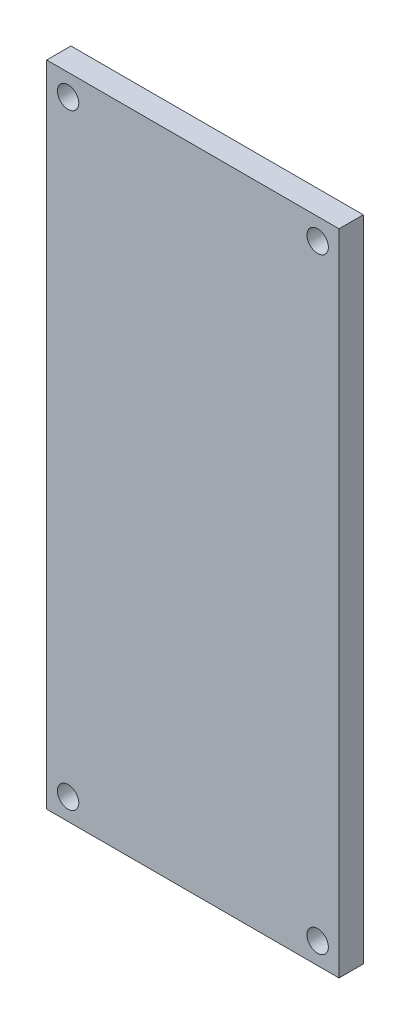
ISO-10303-21;
HEADER;
FILE_DESCRIPTION(('STEP AP214'),'2;1');
FILE_NAME('part.step','',(''),(''),'','','');
FILE_SCHEMA(('AUTOMOTIVE_DESIGN { 1 0 10303 214 1 1 1 1 }'));
ENDSEC;
DATA;
#1=APPLICATION_CONTEXT('core data for automotive mechanical design processes');
#2=APPLICATION_PROTOCOL_DEFINITION('international standard','automotive_design',2000,#1);
#3=PRODUCT_CONTEXT('',#1,'mechanical');
#4=PRODUCT('Part','Part','',(#3));
#5=PRODUCT_RELATED_PRODUCT_CATEGORY('part','',(#4));
#6=PRODUCT_DEFINITION_FORMATION('','',#4);
#7=PRODUCT_DEFINITION_CONTEXT('part definition',#1,'design');
#8=PRODUCT_DEFINITION('design','',#6,#7);
#9=PRODUCT_DEFINITION_SHAPE('','',#8);
#10=(LENGTH_UNIT() NAMED_UNIT(*) SI_UNIT(.MILLI.,.METRE.));
#11=(NAMED_UNIT(*) PLANE_ANGLE_UNIT() SI_UNIT($,.RADIAN.));
#12=(NAMED_UNIT(*) SI_UNIT($,.STERADIAN.) SOLID_ANGLE_UNIT());
#13=UNCERTAINTY_MEASURE_WITH_UNIT(LENGTH_MEASURE(1.E-05),#10,'distance_accuracy_value','');
#14=(GEOMETRIC_REPRESENTATION_CONTEXT(3) GLOBAL_UNCERTAINTY_ASSIGNED_CONTEXT((#13)) GLOBAL_UNIT_ASSIGNED_CONTEXT((#10,
#11,#12)) REPRESENTATION_CONTEXT('',''));
#15=CARTESIAN_POINT('',(0.,0.,0.));
#16=DIRECTION('',(0.,0.,1.));
#17=DIRECTION('',(1.,0.,0.));
#18=AXIS2_PLACEMENT_3D('',#15,#16,#17);
#19=CARTESIAN_POINT('',(-10.25,22.75,1.7));
#20=DIRECTION('',(1.,0.,0.));
#21=DIRECTION('',(0.,0.,-1.));
#22=AXIS2_PLACEMENT_3D('',#19,#20,#21);
#23=PLANE('',#22);
#24=DIRECTION('',(0.,-1.,0.));
#25=VECTOR('',#24,1.);
#26=CARTESIAN_POINT('',(-10.25,22.75,0.));
#27=LINE('',#26,#25);
#28=CARTESIAN_POINT('',(-10.25,22.75,0.));
#29=VERTEX_POINT('',#28);
#30=CARTESIAN_POINT('',(-10.25,-22.75,0.));
#31=VERTEX_POINT('',#30);
#32=EDGE_CURVE('E98',#29,#31,#27,.T.);
#33=ORIENTED_EDGE('',*,*,#32,.T.);
#34=DIRECTION('',(0.,0.,-1.));
#35=VECTOR('',#34,1.);
#36=CARTESIAN_POINT('',(-10.25,-22.75,1.7));
#37=LINE('',#36,#35);
#38=CARTESIAN_POINT('',(-10.25,-22.75,1.7));
#39=VERTEX_POINT('',#38);
#40=EDGE_CURVE('E11',#39,#31,#37,.T.);
#41=ORIENTED_EDGE('',*,*,#40,.F.);
#42=DIRECTION('',(0.,-1.,0.));
#43=VECTOR('',#42,1.);
#44=CARTESIAN_POINT('',(-10.25,22.75,1.7));
#45=LINE('',#44,#43);
#46=CARTESIAN_POINT('',(-10.25,22.75,1.7));
#47=VERTEX_POINT('',#46);
#48=EDGE_CURVE('E86',#47,#39,#45,.T.);
#49=ORIENTED_EDGE('',*,*,#48,.F.);
#50=DIRECTION('',(0.,0.,-1.));
#51=VECTOR('',#50,1.);
#52=CARTESIAN_POINT('',(-10.25,22.75,1.7));
#53=LINE('',#52,#51);
#54=EDGE_CURVE('E94',#47,#29,#53,.T.);
#55=ORIENTED_EDGE('',*,*,#54,.T.);
#56=EDGE_LOOP('',(#33,#41,#49,#55));
#57=FACE_BOUND('',#56,.T.);
#58=ADVANCED_FACE('F35',(#57),#23,.F.);
#59=CARTESIAN_POINT('',(-10.25,-22.75,1.7));
#60=DIRECTION('',(0.,1.,0.));
#61=DIRECTION('',(0.,0.,1.));
#62=AXIS2_PLACEMENT_3D('',#59,#60,#61);
#63=PLANE('',#62);
#64=DIRECTION('',(1.,0.,0.));
#65=VECTOR('',#64,1.);
#66=CARTESIAN_POINT('',(-10.25,-22.75,0.));
#67=LINE('',#66,#65);
#68=CARTESIAN_POINT('',(10.25,-22.75,0.));
#69=VERTEX_POINT('',#68);
#70=EDGE_CURVE('E90',#31,#69,#67,.T.);
#71=ORIENTED_EDGE('',*,*,#70,.T.);
#72=DIRECTION('',(0.,0.,-1.));
#73=VECTOR('',#72,1.);
#74=CARTESIAN_POINT('',(10.25,-22.75,1.7));
#75=LINE('',#74,#73);
#76=CARTESIAN_POINT('',(10.25,-22.75,1.7));
#77=VERTEX_POINT('',#76);
#78=EDGE_CURVE('E43',#77,#69,#75,.T.);
#79=ORIENTED_EDGE('',*,*,#78,.F.);
#80=DIRECTION('',(1.,0.,0.));
#81=VECTOR('',#80,1.);
#82=CARTESIAN_POINT('',(-10.25,-22.75,1.7));
#83=LINE('',#82,#81);
#84=EDGE_CURVE('E81',#39,#77,#83,.T.);
#85=ORIENTED_EDGE('',*,*,#84,.F.);
#86=ORIENTED_EDGE('',*,*,#40,.T.);
#87=EDGE_LOOP('',(#71,#79,#85,#86));
#88=FACE_BOUND('',#87,.T.);
#89=ADVANCED_FACE('F89',(#88),#63,.F.);
#90=CARTESIAN_POINT('',(10.25,22.75,1.7));
#91=DIRECTION('',(-1.,0.,0.));
#92=DIRECTION('',(0.,0.,1.));
#93=AXIS2_PLACEMENT_3D('',#90,#91,#92);
#94=PLANE('',#93);
#95=DIRECTION('',(0.,1.,0.));
#96=VECTOR('',#95,1.);
#97=CARTESIAN_POINT('',(10.25,22.75,0.));
#98=LINE('',#97,#96);
#99=CARTESIAN_POINT('',(10.25,22.75,0.));
#100=VERTEX_POINT('',#99);
#101=EDGE_CURVE('E68',#69,#100,#98,.T.);
#102=ORIENTED_EDGE('',*,*,#101,.T.);
#103=DIRECTION('',(0.,0.,-1.));
#104=VECTOR('',#103,1.);
#105=CARTESIAN_POINT('',(10.25,22.75,1.7));
#106=LINE('',#105,#104);
#107=CARTESIAN_POINT('',(10.25,22.75,1.7));
#108=VERTEX_POINT('',#107);
#109=EDGE_CURVE('E91',#108,#100,#106,.T.);
#110=ORIENTED_EDGE('',*,*,#109,.F.);
#111=DIRECTION('',(0.,1.,0.));
#112=VECTOR('',#111,1.);
#113=CARTESIAN_POINT('',(10.25,22.75,1.7));
#114=LINE('',#113,#112);
#115=EDGE_CURVE('E84',#77,#108,#114,.T.);
#116=ORIENTED_EDGE('',*,*,#115,.F.);
#117=ORIENTED_EDGE('',*,*,#78,.T.);
#118=EDGE_LOOP('',(#102,#110,#116,#117));
#119=FACE_BOUND('',#118,.T.);
#120=ADVANCED_FACE('F92',(#119),#94,.F.);
#121=CARTESIAN_POINT('',(-10.25,22.75,1.7));
#122=DIRECTION('',(0.,-1.,0.));
#123=DIRECTION('',(0.,0.,-1.));
#124=AXIS2_PLACEMENT_3D('',#121,#122,#123);
#125=PLANE('',#124);
#126=DIRECTION('',(-1.,0.,0.));
#127=VECTOR('',#126,1.);
#128=CARTESIAN_POINT('',(-10.25,22.75,0.));
#129=LINE('',#128,#127);
#130=EDGE_CURVE('E74',#100,#29,#129,.T.);
#131=ORIENTED_EDGE('',*,*,#130,.T.);
#132=ORIENTED_EDGE('',*,*,#54,.F.);
#133=DIRECTION('',(-1.,0.,0.));
#134=VECTOR('',#133,1.);
#135=CARTESIAN_POINT('',(-10.25,22.75,1.7));
#136=LINE('',#135,#134);
#137=EDGE_CURVE('E51',#108,#47,#136,.T.);
#138=ORIENTED_EDGE('',*,*,#137,.F.);
#139=ORIENTED_EDGE('',*,*,#109,.T.);
#140=EDGE_LOOP('',(#131,#132,#138,#139));
#141=FACE_BOUND('',#140,.T.);
#142=ADVANCED_FACE('F106',(#141),#125,.F.);
#143=CARTESIAN_POINT('',(-10.25,-22.75,1.7));
#144=DIRECTION('',(0.,0.,1.));
#145=DIRECTION('',(1.,0.,0.));
#146=AXIS2_PLACEMENT_3D('',#143,#144,#145);
#147=PLANE('',#146);
#148=CARTESIAN_POINT('',(8.75000000000003,21.25,1.7));
#149=DIRECTION('',(0.,0.,1.));
#150=DIRECTION('',(-1.,0.,0.));
#151=AXIS2_PLACEMENT_3D('',#148,#149,#150);
#152=CIRCLE('',#151,0.75);
#153=CARTESIAN_POINT('',(8.00000000000003,21.25,1.7));
#154=VERTEX_POINT('',#153);
#155=EDGE_CURVE('E132',#154,#154,#152,.T.);
#156=ORIENTED_EDGE('',*,*,#155,.F.);
#157=EDGE_LOOP('',(#156));
#158=FACE_BOUND('',#157,.T.);
#159=CARTESIAN_POINT('',(-8.74999999999998,21.25,1.7));
#160=DIRECTION('',(0.,0.,1.));
#161=DIRECTION('',(1.,0.,0.));
#162=AXIS2_PLACEMENT_3D('',#159,#160,#161);
#163=CIRCLE('',#162,0.75);
#164=CARTESIAN_POINT('',(-7.99999999999998,21.25,1.7));
#165=VERTEX_POINT('',#164);
#166=EDGE_CURVE('E126',#165,#165,#163,.T.);
#167=ORIENTED_EDGE('',*,*,#166,.F.);
#168=EDGE_LOOP('',(#167));
#169=FACE_BOUND('',#168,.T.);
#170=CARTESIAN_POINT('',(-8.75,-21.25,1.7));
#171=DIRECTION('',(0.,0.,1.));
#172=DIRECTION('',(-1.,0.,0.));
#173=AXIS2_PLACEMENT_3D('',#170,#171,#172);
#174=CIRCLE('',#173,0.75);
#175=CARTESIAN_POINT('',(-9.50000000000001,-21.25,1.7));
#176=VERTEX_POINT('',#175);
#177=EDGE_CURVE('E120',#176,#176,#174,.T.);
#178=ORIENTED_EDGE('',*,*,#177,.F.);
#179=EDGE_LOOP('',(#178));
#180=FACE_BOUND('',#179,.T.);
#181=CARTESIAN_POINT('',(8.75,-21.25,1.7));
#182=DIRECTION('',(0.,0.,1.));
#183=DIRECTION('',(1.,0.,0.));
#184=AXIS2_PLACEMENT_3D('',#181,#182,#183);
#185=CIRCLE('',#184,0.75);
#186=CARTESIAN_POINT('',(9.50000000000001,-21.25,1.7));
#187=VERTEX_POINT('',#186);
#188=EDGE_CURVE('E114',#187,#187,#185,.T.);
#189=ORIENTED_EDGE('',*,*,#188,.F.);
#190=EDGE_LOOP('',(#189));
#191=FACE_BOUND('',#190,.T.);
#192=ORIENTED_EDGE('',*,*,#48,.T.);
#193=ORIENTED_EDGE('',*,*,#84,.T.);
#194=ORIENTED_EDGE('',*,*,#115,.T.);
#195=ORIENTED_EDGE('',*,*,#137,.T.);
#196=EDGE_LOOP('',(#192,#193,#194,#195));
#197=FACE_BOUND('',#196,.T.);
#198=ADVANCED_FACE('F82',(#158,#169,#180,#191,#197),#147,.T.);
#199=CARTESIAN_POINT('',(-10.25,-22.75,0.));
#200=DIRECTION('',(0.,0.,1.));
#201=DIRECTION('',(1.,0.,0.));
#202=AXIS2_PLACEMENT_3D('',#199,#200,#201);
#203=PLANE('',#202);
#204=CARTESIAN_POINT('',(8.75000000000003,21.25,0.));
#205=DIRECTION('',(0.,0.,1.));
#206=DIRECTION('',(1.,0.,0.));
#207=AXIS2_PLACEMENT_3D('',#204,#205,#206);
#208=CIRCLE('',#207,0.75);
#209=CARTESIAN_POINT('',(9.50000000000003,21.25,0.));
#210=VERTEX_POINT('',#209);
#211=EDGE_CURVE('E129',#210,#210,#208,.F.);
#212=ORIENTED_EDGE('',*,*,#211,.F.);
#213=EDGE_LOOP('',(#212));
#214=FACE_BOUND('',#213,.T.);
#215=CARTESIAN_POINT('',(-8.74999999999998,21.25,0.));
#216=DIRECTION('',(0.,0.,1.));
#217=DIRECTION('',(1.,0.,0.));
#218=AXIS2_PLACEMENT_3D('',#215,#216,#217);
#219=CIRCLE('',#218,0.75);
#220=CARTESIAN_POINT('',(-7.99999999999998,21.25,0.));
#221=VERTEX_POINT('',#220);
#222=EDGE_CURVE('E123',#221,#221,#219,.F.);
#223=ORIENTED_EDGE('',*,*,#222,.F.);
#224=EDGE_LOOP('',(#223));
#225=FACE_BOUND('',#224,.T.);
#226=CARTESIAN_POINT('',(-8.75,-21.25,0.));
#227=DIRECTION('',(0.,0.,1.));
#228=DIRECTION('',(1.,0.,0.));
#229=AXIS2_PLACEMENT_3D('',#226,#227,#228);
#230=CIRCLE('',#229,0.75);
#231=CARTESIAN_POINT('',(-8.,-21.25,0.));
#232=VERTEX_POINT('',#231);
#233=EDGE_CURVE('E117',#232,#232,#230,.F.);
#234=ORIENTED_EDGE('',*,*,#233,.F.);
#235=EDGE_LOOP('',(#234));
#236=FACE_BOUND('',#235,.T.);
#237=CARTESIAN_POINT('',(8.75,-21.25,0.));
#238=DIRECTION('',(0.,0.,1.));
#239=DIRECTION('',(1.,0.,0.));
#240=AXIS2_PLACEMENT_3D('',#237,#238,#239);
#241=CIRCLE('',#240,0.75);
#242=CARTESIAN_POINT('',(9.50000000000001,-21.25,0.));
#243=VERTEX_POINT('',#242);
#244=EDGE_CURVE('E101',#243,#243,#241,.F.);
#245=ORIENTED_EDGE('',*,*,#244,.F.);
#246=EDGE_LOOP('',(#245));
#247=FACE_BOUND('',#246,.T.);
#248=ORIENTED_EDGE('',*,*,#32,.F.);
#249=ORIENTED_EDGE('',*,*,#130,.F.);
#250=ORIENTED_EDGE('',*,*,#101,.F.);
#251=ORIENTED_EDGE('',*,*,#70,.F.);
#252=EDGE_LOOP('',(#248,#249,#250,#251));
#253=FACE_BOUND('',#252,.T.);
#254=ADVANCED_FACE('F109',(#214,#225,#236,#247,#253),#203,.F.);
#255=CARTESIAN_POINT('',(8.75,-21.25,-2.12132034355964));
#256=DIRECTION('',(0.,0.,1.));
#257=DIRECTION('',(1.,0.,0.));
#258=AXIS2_PLACEMENT_3D('',#255,#256,#257);
#259=CYLINDRICAL_SURFACE('',#258,0.75);
#260=ORIENTED_EDGE('',*,*,#244,.T.);
#261=EDGE_LOOP('',(#260));
#262=FACE_BOUND('',#261,.T.);
#263=ORIENTED_EDGE('',*,*,#188,.T.);
#264=EDGE_LOOP('',(#263));
#265=FACE_BOUND('',#264,.T.);
#266=ADVANCED_FACE('F147',(#262,#265),#259,.F.);
#267=CARTESIAN_POINT('',(-8.75,-21.25,-2.12132034355964));
#268=DIRECTION('',(0.,0.,1.));
#269=DIRECTION('',(1.,0.,0.));
#270=AXIS2_PLACEMENT_3D('',#267,#268,#269);
#271=CYLINDRICAL_SURFACE('',#270,0.75);
#272=ORIENTED_EDGE('',*,*,#233,.T.);
#273=EDGE_LOOP('',(#272));
#274=FACE_BOUND('',#273,.T.);
#275=ORIENTED_EDGE('',*,*,#177,.T.);
#276=EDGE_LOOP('',(#275));
#277=FACE_BOUND('',#276,.T.);
#278=ADVANCED_FACE('F149',(#274,#277),#271,.F.);
#279=CARTESIAN_POINT('',(-8.74999999999998,21.25,-2.12132034355964));
#280=DIRECTION('',(0.,0.,1.));
#281=DIRECTION('',(1.,0.,0.));
#282=AXIS2_PLACEMENT_3D('',#279,#280,#281);
#283=CYLINDRICAL_SURFACE('',#282,0.75);
#284=ORIENTED_EDGE('',*,*,#222,.T.);
#285=EDGE_LOOP('',(#284));
#286=FACE_BOUND('',#285,.T.);
#287=ORIENTED_EDGE('',*,*,#166,.T.);
#288=EDGE_LOOP('',(#287));
#289=FACE_BOUND('',#288,.T.);
#290=ADVANCED_FACE('F156',(#286,#289),#283,.F.);
#291=CARTESIAN_POINT('',(8.75000000000003,21.25,-2.12132034355964));
#292=DIRECTION('',(0.,0.,1.));
#293=DIRECTION('',(1.,0.,0.));
#294=AXIS2_PLACEMENT_3D('',#291,#292,#293);
#295=CYLINDRICAL_SURFACE('',#294,0.75);
#296=ORIENTED_EDGE('',*,*,#211,.T.);
#297=EDGE_LOOP('',(#296));
#298=FACE_BOUND('',#297,.T.);
#299=ORIENTED_EDGE('',*,*,#155,.T.);
#300=EDGE_LOOP('',(#299));
#301=FACE_BOUND('',#300,.T.);
#302=ADVANCED_FACE('F136',(#298,#301),#295,.F.);
#303=CLOSED_SHELL('',(#58,#89,#120,#142,#198,#254,#266,#278,#290,#302));
#304=MANIFOLD_SOLID_BREP('B2',#303);
#305=ADVANCED_BREP_SHAPE_REPRESENTATION('',(#18,#304),#14);
#306=SHAPE_DEFINITION_REPRESENTATION(#9,#305);
ENDSEC;
END-ISO-10303-21;
